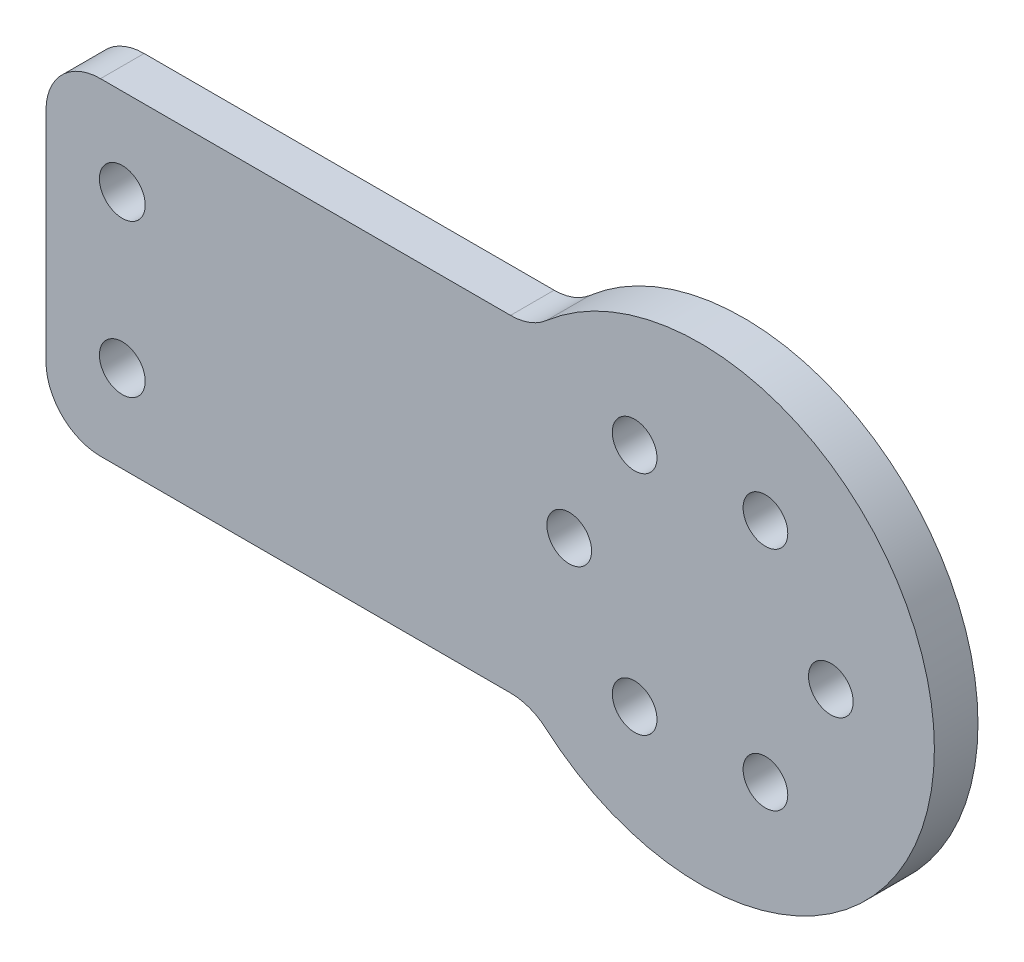
ISO-10303-21;
HEADER;
FILE_DESCRIPTION(('STEP AP214'),'2;1');
FILE_NAME('part.step','',(''),(''),'','','');
FILE_SCHEMA(('AUTOMOTIVE_DESIGN { 1 0 10303 214 1 1 1 1 }'));
ENDSEC;
DATA;
#1=APPLICATION_CONTEXT('core data for automotive mechanical design processes');
#2=APPLICATION_PROTOCOL_DEFINITION('international standard','automotive_design',2000,#1);
#3=PRODUCT_CONTEXT('',#1,'mechanical');
#4=PRODUCT('Part','Part','',(#3));
#5=PRODUCT_RELATED_PRODUCT_CATEGORY('part','',(#4));
#6=PRODUCT_DEFINITION_FORMATION('','',#4);
#7=PRODUCT_DEFINITION_CONTEXT('part definition',#1,'design');
#8=PRODUCT_DEFINITION('design','',#6,#7);
#9=PRODUCT_DEFINITION_SHAPE('','',#8);
#10=(LENGTH_UNIT() NAMED_UNIT(*) SI_UNIT(.MILLI.,.METRE.));
#11=(NAMED_UNIT(*) PLANE_ANGLE_UNIT() SI_UNIT($,.RADIAN.));
#12=(NAMED_UNIT(*) SI_UNIT($,.STERADIAN.) SOLID_ANGLE_UNIT());
#13=UNCERTAINTY_MEASURE_WITH_UNIT(LENGTH_MEASURE(1.E-05),#10,'distance_accuracy_value','');
#14=(GEOMETRIC_REPRESENTATION_CONTEXT(3) GLOBAL_UNCERTAINTY_ASSIGNED_CONTEXT((#13)) GLOBAL_UNIT_ASSIGNED_CONTEXT((#10,
#11,#12)) REPRESENTATION_CONTEXT('',''));
#15=CARTESIAN_POINT('',(0.,0.,0.));
#16=DIRECTION('',(0.,0.,1.));
#17=DIRECTION('',(1.,0.,0.));
#18=AXIS2_PLACEMENT_3D('',#15,#16,#17);
#19=CARTESIAN_POINT('',(0.,0.,4.));
#20=DIRECTION('',(0.,0.,-1.));
#21=DIRECTION('',(-1.,0.,0.));
#22=AXIS2_PLACEMENT_3D('',#19,#20,#21);
#23=PLANE('',#22);
#24=CARTESIAN_POINT('',(-53.,6.99999999999999,4.));
#25=DIRECTION('',(0.,0.,1.));
#26=DIRECTION('',(1.,0.,0.));
#27=AXIS2_PLACEMENT_3D('',#24,#25,#26);
#28=CIRCLE('',#27,2.1);
#29=CARTESIAN_POINT('',(-50.9,6.99999999999999,4.));
#30=VERTEX_POINT('',#29);
#31=EDGE_CURVE('E218',#30,#30,#28,.T.);
#32=ORIENTED_EDGE('',*,*,#31,.F.);
#33=EDGE_LOOP('',(#32));
#34=FACE_BOUND('',#33,.T.);
#35=CARTESIAN_POINT('',(-53.,-7.00000000000001,4.));
#36=DIRECTION('',(0.,0.,1.));
#37=DIRECTION('',(1.,0.,0.));
#38=AXIS2_PLACEMENT_3D('',#35,#36,#37);
#39=CIRCLE('',#38,2.1);
#40=CARTESIAN_POINT('',(-50.9,-7.00000000000001,4.));
#41=VERTEX_POINT('',#40);
#42=EDGE_CURVE('E227',#41,#41,#39,.T.);
#43=ORIENTED_EDGE('',*,*,#42,.F.);
#44=EDGE_LOOP('',(#43));
#45=FACE_BOUND('',#44,.T.);
#46=DIRECTION('',(0.,-1.,0.));
#47=VECTOR('',#46,1.);
#48=CARTESIAN_POINT('',(-60.,0.,4.));
#49=LINE('',#48,#47);
#50=CARTESIAN_POINT('',(-60.,9.99999999999999,4.));
#51=VERTEX_POINT('',#50);
#52=CARTESIAN_POINT('',(-60.,-10.,4.));
#53=VERTEX_POINT('',#52);
#54=EDGE_CURVE('E204',#51,#53,#49,.T.);
#55=ORIENTED_EDGE('',*,*,#54,.T.);
#56=CARTESIAN_POINT('',(-55.,-10.,4.));
#57=DIRECTION('',(0.,0.,-1.));
#58=DIRECTION('',(-1.,0.,0.));
#59=AXIS2_PLACEMENT_3D('',#56,#57,#58);
#60=CIRCLE('',#59,5.);
#61=CARTESIAN_POINT('',(-55.,-15.,4.));
#62=VERTEX_POINT('',#61);
#63=EDGE_CURVE('E166',#53,#62,#60,.F.);
#64=ORIENTED_EDGE('',*,*,#63,.T.);
#65=DIRECTION('',(1.,0.,0.));
#66=VECTOR('',#65,1.);
#67=CARTESIAN_POINT('',(-60.,-15.,4.));
#68=LINE('',#67,#66);
#69=CARTESIAN_POINT('',(-17.3853386507137,-15.,4.));
#70=VERTEX_POINT('',#69);
#71=EDGE_CURVE('E132',#62,#70,#68,.T.);
#72=ORIENTED_EDGE('',*,*,#71,.T.);
#73=CARTESIAN_POINT('',(-17.3853386507137,-20.,4.));
#74=DIRECTION('',(0.,0.,-1.));
#75=DIRECTION('',(-1.,0.,0.));
#76=AXIS2_PLACEMENT_3D('',#73,#74,#75);
#77=CIRCLE('',#76,5.);
#78=CARTESIAN_POINT('',(-14.1050860751073,-16.2264150943396,4.));
#79=VERTEX_POINT('',#78);
#80=EDGE_CURVE('E184',#70,#79,#77,.T.);
#81=ORIENTED_EDGE('',*,*,#80,.T.);
#82=CARTESIAN_POINT('',(0.,0.,4.));
#83=DIRECTION('',(0.,0.,1.));
#84=DIRECTION('',(-1.,0.,0.));
#85=AXIS2_PLACEMENT_3D('',#82,#83,#84);
#86=CIRCLE('',#85,21.5);
#87=CARTESIAN_POINT('',(-14.1050860751074,16.2264150943396,4.));
#88=VERTEX_POINT('',#87);
#89=EDGE_CURVE('E141',#79,#88,#86,.T.);
#90=ORIENTED_EDGE('',*,*,#89,.T.);
#91=CARTESIAN_POINT('',(-17.3853386507137,20.,4.));
#92=DIRECTION('',(0.,0.,-1.));
#93=DIRECTION('',(-1.,0.,0.));
#94=AXIS2_PLACEMENT_3D('',#91,#92,#93);
#95=CIRCLE('',#94,5.);
#96=CARTESIAN_POINT('',(-17.3853386507137,15.,4.));
#97=VERTEX_POINT('',#96);
#98=EDGE_CURVE('E11',#88,#97,#95,.T.);
#99=ORIENTED_EDGE('',*,*,#98,.T.);
#100=DIRECTION('',(-1.,0.,0.));
#101=VECTOR('',#100,1.);
#102=CARTESIAN_POINT('',(-60.,15.,4.));
#103=LINE('',#102,#101);
#104=CARTESIAN_POINT('',(-55.,15.,4.));
#105=VERTEX_POINT('',#104);
#106=EDGE_CURVE('E147',#97,#105,#103,.T.);
#107=ORIENTED_EDGE('',*,*,#106,.T.);
#108=CARTESIAN_POINT('',(-55.,9.99999999999999,4.));
#109=DIRECTION('',(0.,0.,-1.));
#110=DIRECTION('',(-1.,0.,0.));
#111=AXIS2_PLACEMENT_3D('',#108,#109,#110);
#112=CIRCLE('',#111,5.);
#113=EDGE_CURVE('E163',#105,#51,#112,.F.);
#114=ORIENTED_EDGE('',*,*,#113,.T.);
#115=EDGE_LOOP('',(#55,#64,#72,#81,#90,#99,#107,#114));
#116=FACE_BOUND('',#115,.T.);
#117=CARTESIAN_POINT('',(12.,0.,4.));
#118=DIRECTION('',(0.,0.,1.));
#119=DIRECTION('',(1.,0.,0.));
#120=AXIS2_PLACEMENT_3D('',#117,#118,#119);
#121=CIRCLE('',#120,2.05);
#122=CARTESIAN_POINT('',(14.05,0.,4.));
#123=VERTEX_POINT('',#122);
#124=EDGE_CURVE('E199',#123,#123,#121,.T.);
#125=ORIENTED_EDGE('',*,*,#124,.F.);
#126=EDGE_LOOP('',(#125));
#127=FACE_BOUND('',#126,.T.);
#128=CARTESIAN_POINT('',(5.99999999999998,-10.3923048454133,4.));
#129=DIRECTION('',(0.,0.,1.));
#130=DIRECTION('',(1.,0.,0.));
#131=AXIS2_PLACEMENT_3D('',#128,#129,#130);
#132=CIRCLE('',#131,2.05);
#133=CARTESIAN_POINT('',(8.04999999999998,-10.3923048454133,4.));
#134=VERTEX_POINT('',#133);
#135=EDGE_CURVE('E235',#134,#134,#132,.T.);
#136=ORIENTED_EDGE('',*,*,#135,.F.);
#137=EDGE_LOOP('',(#136));
#138=FACE_BOUND('',#137,.T.);
#139=CARTESIAN_POINT('',(-6.00000000000005,-10.3923048454132,4.));
#140=DIRECTION('',(0.,0.,1.));
#141=DIRECTION('',(1.,0.,0.));
#142=AXIS2_PLACEMENT_3D('',#139,#140,#141);
#143=CIRCLE('',#142,2.05);
#144=CARTESIAN_POINT('',(-3.95000000000005,-10.3923048454132,4.));
#145=VERTEX_POINT('',#144);
#146=EDGE_CURVE('E241',#145,#145,#143,.T.);
#147=ORIENTED_EDGE('',*,*,#146,.F.);
#148=EDGE_LOOP('',(#147));
#149=FACE_BOUND('',#148,.T.);
#150=CARTESIAN_POINT('',(-12.,0.,4.));
#151=DIRECTION('',(0.,0.,1.));
#152=DIRECTION('',(1.,0.,0.));
#153=AXIS2_PLACEMENT_3D('',#150,#151,#152);
#154=CIRCLE('',#153,2.05);
#155=CARTESIAN_POINT('',(-9.95,0.,4.));
#156=VERTEX_POINT('',#155);
#157=EDGE_CURVE('E249',#156,#156,#154,.T.);
#158=ORIENTED_EDGE('',*,*,#157,.F.);
#159=EDGE_LOOP('',(#158));
#160=FACE_BOUND('',#159,.T.);
#161=CARTESIAN_POINT('',(-5.9999999999999,10.3923048454133,4.));
#162=DIRECTION('',(0.,0.,1.));
#163=DIRECTION('',(1.,0.,0.));
#164=AXIS2_PLACEMENT_3D('',#161,#162,#163);
#165=CIRCLE('',#164,2.05);
#166=CARTESIAN_POINT('',(-3.94999999999991,10.3923048454133,4.));
#167=VERTEX_POINT('',#166);
#168=EDGE_CURVE('E220',#167,#167,#165,.T.);
#169=ORIENTED_EDGE('',*,*,#168,.F.);
#170=EDGE_LOOP('',(#169));
#171=FACE_BOUND('',#170,.T.);
#172=CARTESIAN_POINT('',(6.00000000000012,10.3923048454132,4.));
#173=DIRECTION('',(0.,0.,1.));
#174=DIRECTION('',(1.,0.,0.));
#175=AXIS2_PLACEMENT_3D('',#172,#173,#174);
#176=CIRCLE('',#175,2.05);
#177=CARTESIAN_POINT('',(8.05000000000012,10.3923048454132,4.));
#178=VERTEX_POINT('',#177);
#179=EDGE_CURVE('E260',#178,#178,#176,.T.);
#180=ORIENTED_EDGE('',*,*,#179,.F.);
#181=EDGE_LOOP('',(#180));
#182=FACE_BOUND('',#181,.T.);
#183=ADVANCED_FACE('F45',(#34,#45,#116,#127,#138,#149,#160,#171,#182),#23,.F.);
#184=CARTESIAN_POINT('',(0.,0.,0.));
#185=DIRECTION('',(0.,0.,-1.));
#186=DIRECTION('',(-1.,0.,0.));
#187=AXIS2_PLACEMENT_3D('',#184,#185,#186);
#188=PLANE('',#187);
#189=CARTESIAN_POINT('',(-53.,6.99999999999999,0.));
#190=DIRECTION('',(0.,0.,1.));
#191=DIRECTION('',(1.,0.,0.));
#192=AXIS2_PLACEMENT_3D('',#189,#190,#191);
#193=CIRCLE('',#192,2.1);
#194=CARTESIAN_POINT('',(-50.9,6.99999999999999,0.));
#195=VERTEX_POINT('',#194);
#196=EDGE_CURVE('E214',#195,#195,#193,.T.);
#197=ORIENTED_EDGE('',*,*,#196,.T.);
#198=EDGE_LOOP('',(#197));
#199=FACE_BOUND('',#198,.T.);
#200=CARTESIAN_POINT('',(-53.,-7.00000000000001,0.));
#201=DIRECTION('',(0.,0.,1.));
#202=DIRECTION('',(1.,0.,0.));
#203=AXIS2_PLACEMENT_3D('',#200,#201,#202);
#204=CIRCLE('',#203,2.1);
#205=CARTESIAN_POINT('',(-50.9,-7.00000000000001,0.));
#206=VERTEX_POINT('',#205);
#207=EDGE_CURVE('E268',#206,#206,#204,.T.);
#208=ORIENTED_EDGE('',*,*,#207,.T.);
#209=EDGE_LOOP('',(#208));
#210=FACE_BOUND('',#209,.T.);
#211=CARTESIAN_POINT('',(-5.9999999999999,10.3923048454133,0.));
#212=DIRECTION('',(0.,0.,1.));
#213=DIRECTION('',(1.,0.,0.));
#214=AXIS2_PLACEMENT_3D('',#211,#212,#213);
#215=CIRCLE('',#214,2.05);
#216=CARTESIAN_POINT('',(-3.94999999999991,10.3923048454133,0.));
#217=VERTEX_POINT('',#216);
#218=EDGE_CURVE('E224',#217,#217,#215,.T.);
#219=ORIENTED_EDGE('',*,*,#218,.T.);
#220=EDGE_LOOP('',(#219));
#221=FACE_BOUND('',#220,.T.);
#222=CARTESIAN_POINT('',(-6.00000000000005,-10.3923048454132,0.));
#223=DIRECTION('',(0.,0.,1.));
#224=DIRECTION('',(1.,0.,0.));
#225=AXIS2_PLACEMENT_3D('',#222,#223,#224);
#226=CIRCLE('',#225,2.05);
#227=CARTESIAN_POINT('',(-3.95000000000005,-10.3923048454132,0.));
#228=VERTEX_POINT('',#227);
#229=EDGE_CURVE('E245',#228,#228,#226,.T.);
#230=ORIENTED_EDGE('',*,*,#229,.T.);
#231=EDGE_LOOP('',(#230));
#232=FACE_BOUND('',#231,.T.);
#233=CARTESIAN_POINT('',(12.,0.,0.));
#234=DIRECTION('',(0.,0.,1.));
#235=DIRECTION('',(1.,0.,0.));
#236=AXIS2_PLACEMENT_3D('',#233,#234,#235);
#237=CIRCLE('',#236,2.05);
#238=CARTESIAN_POINT('',(14.05,0.,0.));
#239=VERTEX_POINT('',#238);
#240=EDGE_CURVE('E230',#239,#239,#237,.T.);
#241=ORIENTED_EDGE('',*,*,#240,.T.);
#242=EDGE_LOOP('',(#241));
#243=FACE_BOUND('',#242,.T.);
#244=DIRECTION('',(1.,0.,0.));
#245=VECTOR('',#244,1.);
#246=CARTESIAN_POINT('',(-60.,-15.,0.));
#247=LINE('',#246,#245);
#248=CARTESIAN_POINT('',(-55.,-15.,0.));
#249=VERTEX_POINT('',#248);
#250=CARTESIAN_POINT('',(-17.3853386507137,-15.,0.));
#251=VERTEX_POINT('',#250);
#252=EDGE_CURVE('E129',#249,#251,#247,.T.);
#253=ORIENTED_EDGE('',*,*,#252,.F.);
#254=CARTESIAN_POINT('',(-55.,-10.,0.));
#255=DIRECTION('',(0.,0.,-1.));
#256=DIRECTION('',(-1.,0.,0.));
#257=AXIS2_PLACEMENT_3D('',#254,#255,#256);
#258=CIRCLE('',#257,5.);
#259=CARTESIAN_POINT('',(-60.,-10.,0.));
#260=VERTEX_POINT('',#259);
#261=EDGE_CURVE('E111',#249,#260,#258,.T.);
#262=ORIENTED_EDGE('',*,*,#261,.T.);
#263=DIRECTION('',(0.,-1.,0.));
#264=VECTOR('',#263,1.);
#265=CARTESIAN_POINT('',(-60.,0.,0.));
#266=LINE('',#265,#264);
#267=CARTESIAN_POINT('',(-60.,9.99999999999999,0.));
#268=VERTEX_POINT('',#267);
#269=EDGE_CURVE('E142',#268,#260,#266,.T.);
#270=ORIENTED_EDGE('',*,*,#269,.F.);
#271=CARTESIAN_POINT('',(-55.,9.99999999999999,0.));
#272=DIRECTION('',(0.,0.,-1.));
#273=DIRECTION('',(-1.,0.,0.));
#274=AXIS2_PLACEMENT_3D('',#271,#272,#273);
#275=CIRCLE('',#274,5.);
#276=CARTESIAN_POINT('',(-55.,15.,0.));
#277=VERTEX_POINT('',#276);
#278=EDGE_CURVE('E123',#268,#277,#275,.T.);
#279=ORIENTED_EDGE('',*,*,#278,.T.);
#280=DIRECTION('',(-1.,0.,0.));
#281=VECTOR('',#280,1.);
#282=CARTESIAN_POINT('',(-60.,15.,0.));
#283=LINE('',#282,#281);
#284=CARTESIAN_POINT('',(-17.3853386507137,15.,0.));
#285=VERTEX_POINT('',#284);
#286=EDGE_CURVE('E150',#285,#277,#283,.T.);
#287=ORIENTED_EDGE('',*,*,#286,.F.);
#288=CARTESIAN_POINT('',(-17.3853386507137,20.,0.));
#289=DIRECTION('',(0.,0.,-1.));
#290=DIRECTION('',(-1.,0.,0.));
#291=AXIS2_PLACEMENT_3D('',#288,#289,#290);
#292=CIRCLE('',#291,5.);
#293=CARTESIAN_POINT('',(-14.1050860751074,16.2264150943396,0.));
#294=VERTEX_POINT('',#293);
#295=EDGE_CURVE('E54',#285,#294,#292,.F.);
#296=ORIENTED_EDGE('',*,*,#295,.T.);
#297=CARTESIAN_POINT('',(0.,0.,0.));
#298=DIRECTION('',(0.,0.,1.));
#299=DIRECTION('',(-1.,0.,0.));
#300=AXIS2_PLACEMENT_3D('',#297,#298,#299);
#301=CIRCLE('',#300,21.5);
#302=CARTESIAN_POINT('',(-14.1050860751073,-16.2264150943396,0.));
#303=VERTEX_POINT('',#302);
#304=EDGE_CURVE('E190',#303,#294,#301,.T.);
#305=ORIENTED_EDGE('',*,*,#304,.F.);
#306=CARTESIAN_POINT('',(-17.3853386507137,-20.,0.));
#307=DIRECTION('',(0.,0.,-1.));
#308=DIRECTION('',(-1.,0.,0.));
#309=AXIS2_PLACEMENT_3D('',#306,#307,#308);
#310=CIRCLE('',#309,5.);
#311=EDGE_CURVE('E139',#303,#251,#310,.F.);
#312=ORIENTED_EDGE('',*,*,#311,.T.);
#313=EDGE_LOOP('',(#253,#262,#270,#279,#287,#296,#305,#312));
#314=FACE_BOUND('',#313,.T.);
#315=CARTESIAN_POINT('',(5.99999999999998,-10.3923048454133,0.));
#316=DIRECTION('',(0.,0.,1.));
#317=DIRECTION('',(1.,0.,0.));
#318=AXIS2_PLACEMENT_3D('',#315,#316,#317);
#319=CIRCLE('',#318,2.05);
#320=CARTESIAN_POINT('',(8.04999999999998,-10.3923048454133,0.));
#321=VERTEX_POINT('',#320);
#322=EDGE_CURVE('E237',#321,#321,#319,.T.);
#323=ORIENTED_EDGE('',*,*,#322,.T.);
#324=EDGE_LOOP('',(#323));
#325=FACE_BOUND('',#324,.T.);
#326=CARTESIAN_POINT('',(-12.,0.,0.));
#327=DIRECTION('',(0.,0.,1.));
#328=DIRECTION('',(1.,0.,0.));
#329=AXIS2_PLACEMENT_3D('',#326,#327,#328);
#330=CIRCLE('',#329,2.05);
#331=CARTESIAN_POINT('',(-9.95,0.,0.));
#332=VERTEX_POINT('',#331);
#333=EDGE_CURVE('E223',#332,#332,#330,.T.);
#334=ORIENTED_EDGE('',*,*,#333,.T.);
#335=EDGE_LOOP('',(#334));
#336=FACE_BOUND('',#335,.T.);
#337=CARTESIAN_POINT('',(6.00000000000012,10.3923048454132,0.));
#338=DIRECTION('',(0.,0.,1.));
#339=DIRECTION('',(1.,0.,0.));
#340=AXIS2_PLACEMENT_3D('',#337,#338,#339);
#341=CIRCLE('',#340,2.05);
#342=CARTESIAN_POINT('',(8.05000000000012,10.3923048454132,0.));
#343=VERTEX_POINT('',#342);
#344=EDGE_CURVE('E217',#343,#343,#341,.T.);
#345=ORIENTED_EDGE('',*,*,#344,.T.);
#346=EDGE_LOOP('',(#345));
#347=FACE_BOUND('',#346,.T.);
#348=ADVANCED_FACE('F136',(#199,#210,#221,#232,#243,#314,#325,#336,#347),#188,.T.);
#349=CARTESIAN_POINT('',(0.,0.,4.));
#350=DIRECTION('',(0.,0.,-1.));
#351=DIRECTION('',(-1.,0.,0.));
#352=AXIS2_PLACEMENT_3D('',#349,#350,#351);
#353=CYLINDRICAL_SURFACE('',#352,21.5);
#354=ORIENTED_EDGE('',*,*,#89,.F.);
#355=DIRECTION('',(0.,0.,-1.));
#356=VECTOR('',#355,1.);
#357=CARTESIAN_POINT('',(-14.1050860751073,-16.2264150943396,4.));
#358=LINE('',#357,#356);
#359=EDGE_CURVE('E178',#79,#303,#358,.T.);
#360=ORIENTED_EDGE('',*,*,#359,.T.);
#361=ORIENTED_EDGE('',*,*,#304,.T.);
#362=DIRECTION('',(0.,0.,-1.));
#363=VECTOR('',#362,1.);
#364=CARTESIAN_POINT('',(-14.1050860751074,16.2264150943396,4.));
#365=LINE('',#364,#363);
#366=EDGE_CURVE('E175',#294,#88,#365,.F.);
#367=ORIENTED_EDGE('',*,*,#366,.T.);
#368=EDGE_LOOP('',(#354,#360,#361,#367));
#369=FACE_BOUND('',#368,.T.);
#370=ADVANCED_FACE('F196',(#369),#353,.T.);
#371=CARTESIAN_POINT('',(-60.,15.,4.));
#372=DIRECTION('',(0.,-1.,0.));
#373=DIRECTION('',(1.,0.,0.));
#374=AXIS2_PLACEMENT_3D('',#371,#372,#373);
#375=PLANE('',#374);
#376=ORIENTED_EDGE('',*,*,#286,.T.);
#377=DIRECTION('',(0.,0.,-1.));
#378=VECTOR('',#377,1.);
#379=CARTESIAN_POINT('',(-55.,15.,4.));
#380=LINE('',#379,#378);
#381=EDGE_CURVE('E61',#277,#105,#380,.F.);
#382=ORIENTED_EDGE('',*,*,#381,.T.);
#383=ORIENTED_EDGE('',*,*,#106,.F.);
#384=DIRECTION('',(0.,0.,1.));
#385=VECTOR('',#384,1.);
#386=CARTESIAN_POINT('',(-17.3853386507137,15.,0.));
#387=LINE('',#386,#385);
#388=EDGE_CURVE('E169',#97,#285,#387,.F.);
#389=ORIENTED_EDGE('',*,*,#388,.T.);
#390=EDGE_LOOP('',(#376,#382,#383,#389));
#391=FACE_BOUND('',#390,.T.);
#392=ADVANCED_FACE('F201',(#391),#375,.F.);
#393=CARTESIAN_POINT('',(-60.,0.,4.));
#394=DIRECTION('',(1.,0.,0.));
#395=DIRECTION('',(0.,0.,-1.));
#396=AXIS2_PLACEMENT_3D('',#393,#394,#395);
#397=PLANE('',#396);
#398=ORIENTED_EDGE('',*,*,#269,.T.);
#399=DIRECTION('',(0.,0.,-1.));
#400=VECTOR('',#399,1.);
#401=CARTESIAN_POINT('',(-60.,-10.,4.));
#402=LINE('',#401,#400);
#403=EDGE_CURVE('E116',#260,#53,#402,.F.);
#404=ORIENTED_EDGE('',*,*,#403,.T.);
#405=ORIENTED_EDGE('',*,*,#54,.F.);
#406=DIRECTION('',(0.,0.,-1.));
#407=VECTOR('',#406,1.);
#408=CARTESIAN_POINT('',(-60.,9.99999999999999,4.));
#409=LINE('',#408,#407);
#410=EDGE_CURVE('E122',#51,#268,#409,.T.);
#411=ORIENTED_EDGE('',*,*,#410,.T.);
#412=EDGE_LOOP('',(#398,#404,#405,#411));
#413=FACE_BOUND('',#412,.T.);
#414=ADVANCED_FACE('F313',(#413),#397,.F.);
#415=CARTESIAN_POINT('',(-60.,-15.,4.));
#416=DIRECTION('',(0.,1.,0.));
#417=DIRECTION('',(-1.,0.,0.));
#418=AXIS2_PLACEMENT_3D('',#415,#416,#417);
#419=PLANE('',#418);
#420=ORIENTED_EDGE('',*,*,#71,.F.);
#421=DIRECTION('',(0.,0.,-1.));
#422=VECTOR('',#421,1.);
#423=CARTESIAN_POINT('',(-55.,-15.,4.));
#424=LINE('',#423,#422);
#425=EDGE_CURVE('E115',#62,#249,#424,.T.);
#426=ORIENTED_EDGE('',*,*,#425,.T.);
#427=ORIENTED_EDGE('',*,*,#252,.T.);
#428=DIRECTION('',(0.,0.,1.));
#429=VECTOR('',#428,1.);
#430=CARTESIAN_POINT('',(-17.3853386507137,-15.,4.));
#431=LINE('',#430,#429);
#432=EDGE_CURVE('E134',#251,#70,#431,.T.);
#433=ORIENTED_EDGE('',*,*,#432,.T.);
#434=EDGE_LOOP('',(#420,#426,#427,#433));
#435=FACE_BOUND('',#434,.T.);
#436=ADVANCED_FACE('F128',(#435),#419,.F.);
#437=CARTESIAN_POINT('',(12.,0.,4.));
#438=DIRECTION('',(0.,0.,-1.));
#439=DIRECTION('',(-1.,0.,0.));
#440=AXIS2_PLACEMENT_3D('',#437,#438,#439);
#441=CYLINDRICAL_SURFACE('',#440,2.05);
#442=ORIENTED_EDGE('',*,*,#124,.T.);
#443=EDGE_LOOP('',(#442));
#444=FACE_BOUND('',#443,.T.);
#445=ORIENTED_EDGE('',*,*,#240,.F.);
#446=EDGE_LOOP('',(#445));
#447=FACE_BOUND('',#446,.T.);
#448=ADVANCED_FACE('F312',(#444,#447),#441,.F.);
#449=CARTESIAN_POINT('',(5.99999999999998,-10.3923048454133,4.));
#450=DIRECTION('',(0.,0.,-1.));
#451=DIRECTION('',(-1.,0.,0.));
#452=AXIS2_PLACEMENT_3D('',#449,#450,#451);
#453=CYLINDRICAL_SURFACE('',#452,2.05);
#454=ORIENTED_EDGE('',*,*,#135,.T.);
#455=EDGE_LOOP('',(#454));
#456=FACE_BOUND('',#455,.T.);
#457=ORIENTED_EDGE('',*,*,#322,.F.);
#458=EDGE_LOOP('',(#457));
#459=FACE_BOUND('',#458,.T.);
#460=ADVANCED_FACE('F440',(#456,#459),#453,.F.);
#461=CARTESIAN_POINT('',(-6.00000000000005,-10.3923048454132,4.));
#462=DIRECTION('',(0.,0.,-1.));
#463=DIRECTION('',(-1.,0.,0.));
#464=AXIS2_PLACEMENT_3D('',#461,#462,#463);
#465=CYLINDRICAL_SURFACE('',#464,2.05);
#466=ORIENTED_EDGE('',*,*,#146,.T.);
#467=EDGE_LOOP('',(#466));
#468=FACE_BOUND('',#467,.T.);
#469=ORIENTED_EDGE('',*,*,#229,.F.);
#470=EDGE_LOOP('',(#469));
#471=FACE_BOUND('',#470,.T.);
#472=ADVANCED_FACE('F430',(#468,#471),#465,.F.);
#473=CARTESIAN_POINT('',(-12.,0.,4.));
#474=DIRECTION('',(0.,0.,-1.));
#475=DIRECTION('',(-1.,0.,0.));
#476=AXIS2_PLACEMENT_3D('',#473,#474,#475);
#477=CYLINDRICAL_SURFACE('',#476,2.05);
#478=ORIENTED_EDGE('',*,*,#157,.T.);
#479=EDGE_LOOP('',(#478));
#480=FACE_BOUND('',#479,.T.);
#481=ORIENTED_EDGE('',*,*,#333,.F.);
#482=EDGE_LOOP('',(#481));
#483=FACE_BOUND('',#482,.T.);
#484=ADVANCED_FACE('F420',(#480,#483),#477,.F.);
#485=CARTESIAN_POINT('',(-5.9999999999999,10.3923048454133,4.));
#486=DIRECTION('',(0.,0.,-1.));
#487=DIRECTION('',(-1.,0.,0.));
#488=AXIS2_PLACEMENT_3D('',#485,#486,#487);
#489=CYLINDRICAL_SURFACE('',#488,2.05);
#490=ORIENTED_EDGE('',*,*,#168,.T.);
#491=EDGE_LOOP('',(#490));
#492=FACE_BOUND('',#491,.T.);
#493=ORIENTED_EDGE('',*,*,#218,.F.);
#494=EDGE_LOOP('',(#493));
#495=FACE_BOUND('',#494,.T.);
#496=ADVANCED_FACE('F297',(#492,#495),#489,.F.);
#497=CARTESIAN_POINT('',(6.00000000000012,10.3923048454132,4.));
#498=DIRECTION('',(0.,0.,-1.));
#499=DIRECTION('',(-1.,0.,0.));
#500=AXIS2_PLACEMENT_3D('',#497,#498,#499);
#501=CYLINDRICAL_SURFACE('',#500,2.05);
#502=ORIENTED_EDGE('',*,*,#179,.T.);
#503=EDGE_LOOP('',(#502));
#504=FACE_BOUND('',#503,.T.);
#505=ORIENTED_EDGE('',*,*,#344,.F.);
#506=EDGE_LOOP('',(#505));
#507=FACE_BOUND('',#506,.T.);
#508=ADVANCED_FACE('F294',(#504,#507),#501,.F.);
#509=CARTESIAN_POINT('',(-53.,-7.00000000000001,0.));
#510=DIRECTION('',(0.,0.,1.));
#511=DIRECTION('',(1.,0.,0.));
#512=AXIS2_PLACEMENT_3D('',#509,#510,#511);
#513=CYLINDRICAL_SURFACE('',#512,2.1);
#514=ORIENTED_EDGE('',*,*,#207,.F.);
#515=EDGE_LOOP('',(#514));
#516=FACE_BOUND('',#515,.T.);
#517=ORIENTED_EDGE('',*,*,#42,.T.);
#518=EDGE_LOOP('',(#517));
#519=FACE_BOUND('',#518,.T.);
#520=ADVANCED_FACE('F276',(#516,#519),#513,.F.);
#521=CARTESIAN_POINT('',(-53.,6.99999999999999,0.));
#522=DIRECTION('',(0.,0.,1.));
#523=DIRECTION('',(1.,0.,0.));
#524=AXIS2_PLACEMENT_3D('',#521,#522,#523);
#525=CYLINDRICAL_SURFACE('',#524,2.1);
#526=ORIENTED_EDGE('',*,*,#196,.F.);
#527=EDGE_LOOP('',(#526));
#528=FACE_BOUND('',#527,.T.);
#529=ORIENTED_EDGE('',*,*,#31,.T.);
#530=EDGE_LOOP('',(#529));
#531=FACE_BOUND('',#530,.T.);
#532=ADVANCED_FACE('F322',(#528,#531),#525,.F.);
#533=CARTESIAN_POINT('',(-55.,-10.,4.));
#534=DIRECTION('',(0.,0.,-1.));
#535=DIRECTION('',(-1.,0.,0.));
#536=AXIS2_PLACEMENT_3D('',#533,#534,#535);
#537=CYLINDRICAL_SURFACE('',#536,5.);
#538=ORIENTED_EDGE('',*,*,#63,.F.);
#539=ORIENTED_EDGE('',*,*,#403,.F.);
#540=ORIENTED_EDGE('',*,*,#261,.F.);
#541=ORIENTED_EDGE('',*,*,#425,.F.);
#542=EDGE_LOOP('',(#538,#539,#540,#541));
#543=FACE_BOUND('',#542,.T.);
#544=ADVANCED_FACE('F114',(#543),#537,.T.);
#545=CARTESIAN_POINT('',(-55.,9.99999999999999,4.));
#546=DIRECTION('',(0.,0.,-1.));
#547=DIRECTION('',(-1.,0.,0.));
#548=AXIS2_PLACEMENT_3D('',#545,#546,#547);
#549=CYLINDRICAL_SURFACE('',#548,5.);
#550=ORIENTED_EDGE('',*,*,#113,.F.);
#551=ORIENTED_EDGE('',*,*,#381,.F.);
#552=ORIENTED_EDGE('',*,*,#278,.F.);
#553=ORIENTED_EDGE('',*,*,#410,.F.);
#554=EDGE_LOOP('',(#550,#551,#552,#553));
#555=FACE_BOUND('',#554,.T.);
#556=ADVANCED_FACE('F321',(#555),#549,.T.);
#557=CARTESIAN_POINT('',(-17.3853386507137,-20.,4.));
#558=DIRECTION('',(0.,0.,-1.));
#559=DIRECTION('',(-1.,0.,0.));
#560=AXIS2_PLACEMENT_3D('',#557,#558,#559);
#561=CYLINDRICAL_SURFACE('',#560,5.);
#562=ORIENTED_EDGE('',*,*,#80,.F.);
#563=ORIENTED_EDGE('',*,*,#432,.F.);
#564=ORIENTED_EDGE('',*,*,#311,.F.);
#565=ORIENTED_EDGE('',*,*,#359,.F.);
#566=EDGE_LOOP('',(#562,#563,#564,#565));
#567=FACE_BOUND('',#566,.T.);
#568=ADVANCED_FACE('F324',(#567),#561,.F.);
#569=CARTESIAN_POINT('',(-17.3853386507137,20.,4.));
#570=DIRECTION('',(0.,0.,-1.));
#571=DIRECTION('',(-1.,0.,0.));
#572=AXIS2_PLACEMENT_3D('',#569,#570,#571);
#573=CYLINDRICAL_SURFACE('',#572,5.);
#574=ORIENTED_EDGE('',*,*,#98,.F.);
#575=ORIENTED_EDGE('',*,*,#366,.F.);
#576=ORIENTED_EDGE('',*,*,#295,.F.);
#577=ORIENTED_EDGE('',*,*,#388,.F.);
#578=EDGE_LOOP('',(#574,#575,#576,#577));
#579=FACE_BOUND('',#578,.T.);
#580=ADVANCED_FACE('F47',(#579),#573,.F.);
#581=CLOSED_SHELL('',(#183,#348,#370,#392,#414,#436,#448,#460,#472,#484,#496,#508,#520,#532,
#544,#556,#568,#580));
#582=MANIFOLD_SOLID_BREP('B2',#581);
#583=ADVANCED_BREP_SHAPE_REPRESENTATION('',(#18,#582),#14);
#584=SHAPE_DEFINITION_REPRESENTATION(#9,#583);
ENDSEC;
END-ISO-10303-21;
